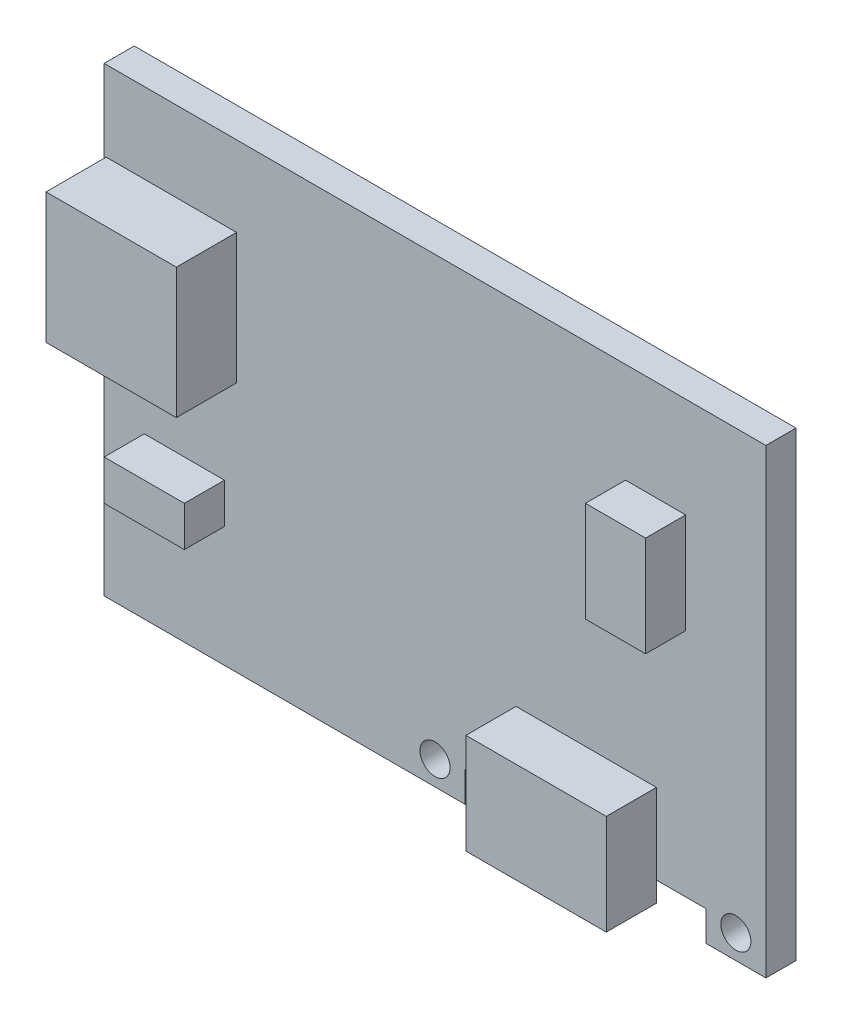
ISO-10303-21;
HEADER;
FILE_DESCRIPTION(('STEP AP214'),'2;1');
FILE_NAME('part.step','',(''),(''),'','','');
FILE_SCHEMA(('AUTOMOTIVE_DESIGN { 1 0 10303 214 1 1 1 1 }'));
ENDSEC;
DATA;
#1=APPLICATION_CONTEXT('core data for automotive mechanical design processes');
#2=APPLICATION_PROTOCOL_DEFINITION('international standard','automotive_design',2000,#1);
#3=PRODUCT_CONTEXT('',#1,'mechanical');
#4=PRODUCT('Part','Part','',(#3));
#5=PRODUCT_RELATED_PRODUCT_CATEGORY('part','',(#4));
#6=PRODUCT_DEFINITION_FORMATION('','',#4);
#7=PRODUCT_DEFINITION_CONTEXT('part definition',#1,'design');
#8=PRODUCT_DEFINITION('design','',#6,#7);
#9=PRODUCT_DEFINITION_SHAPE('','',#8);
#10=(LENGTH_UNIT() NAMED_UNIT(*) SI_UNIT(.MILLI.,.METRE.));
#11=(NAMED_UNIT(*) PLANE_ANGLE_UNIT() SI_UNIT($,.RADIAN.));
#12=(NAMED_UNIT(*) SI_UNIT($,.STERADIAN.) SOLID_ANGLE_UNIT());
#13=UNCERTAINTY_MEASURE_WITH_UNIT(LENGTH_MEASURE(1.E-05),#10,'distance_accuracy_value','');
#14=(GEOMETRIC_REPRESENTATION_CONTEXT(3) GLOBAL_UNCERTAINTY_ASSIGNED_CONTEXT((#13)) GLOBAL_UNIT_ASSIGNED_CONTEXT((#10,
#11,#12)) REPRESENTATION_CONTEXT('',''));
#15=CARTESIAN_POINT('',(0.,0.,0.));
#16=DIRECTION('',(0.,0.,1.));
#17=DIRECTION('',(1.,0.,0.));
#18=AXIS2_PLACEMENT_3D('',#15,#16,#17);
#19=CARTESIAN_POINT('',(0.,0.,1.5));
#20=DIRECTION('',(0.,0.,-1.));
#21=DIRECTION('',(-1.,0.,0.));
#22=AXIS2_PLACEMENT_3D('',#19,#20,#21);
#23=PLANE('',#22);
#24=DIRECTION('',(0.,-1.,0.));
#25=VECTOR('',#24,1.);
#26=CARTESIAN_POINT('',(0.1,19.,1.5));
#27=LINE('',#26,#25);
#28=CARTESIAN_POINT('',(0.1,19.,1.5));
#29=VERTEX_POINT('',#28);
#30=CARTESIAN_POINT('',(0.100000000000001,12.5,1.5));
#31=VERTEX_POINT('',#30);
#32=EDGE_CURVE('E233',#29,#31,#27,.T.);
#33=ORIENTED_EDGE('',*,*,#32,.F.);
#34=DIRECTION('',(-1.,0.,0.));
#35=VECTOR('',#34,1.);
#36=CARTESIAN_POINT('',(0.1,19.,1.5));
#37=LINE('',#36,#35);
#38=CARTESIAN_POINT('',(6.6,19.,1.5));
#39=VERTEX_POINT('',#38);
#40=EDGE_CURVE('E248',#39,#29,#37,.T.);
#41=ORIENTED_EDGE('',*,*,#40,.F.);
#42=DIRECTION('',(0.,1.,0.));
#43=VECTOR('',#42,1.);
#44=CARTESIAN_POINT('',(6.6,19.,1.5));
#45=LINE('',#44,#43);
#46=CARTESIAN_POINT('',(6.6,12.5,1.5));
#47=VERTEX_POINT('',#46);
#48=EDGE_CURVE('E260',#47,#39,#45,.T.);
#49=ORIENTED_EDGE('',*,*,#48,.F.);
#50=DIRECTION('',(1.,0.,0.));
#51=VECTOR('',#50,1.);
#52=CARTESIAN_POINT('',(0.100000000000001,12.5,1.5));
#53=LINE('',#52,#51);
#54=EDGE_CURVE('E63',#31,#47,#53,.T.);
#55=ORIENTED_EDGE('',*,*,#54,.F.);
#56=EDGE_LOOP('',(#33,#41,#49,#55));
#57=FACE_BOUND('',#56,.T.);
#58=DIRECTION('',(0.,-1.,0.));
#59=VECTOR('',#58,1.);
#60=CARTESIAN_POINT('',(2.,8.,1.5));
#61=LINE('',#60,#59);
#62=CARTESIAN_POINT('',(2.,8.,1.5));
#63=VERTEX_POINT('',#62);
#64=CARTESIAN_POINT('',(2.,6.,1.5));
#65=VERTEX_POINT('',#64);
#66=EDGE_CURVE('E326',#63,#65,#61,.T.);
#67=ORIENTED_EDGE('',*,*,#66,.F.);
#68=DIRECTION('',(-1.,0.,0.));
#69=VECTOR('',#68,1.);
#70=CARTESIAN_POINT('',(2.,8.,1.5));
#71=LINE('',#70,#69);
#72=CARTESIAN_POINT('',(6.,8.,1.5));
#73=VERTEX_POINT('',#72);
#74=EDGE_CURVE('E332',#73,#63,#71,.T.);
#75=ORIENTED_EDGE('',*,*,#74,.F.);
#76=DIRECTION('',(0.,1.,0.));
#77=VECTOR('',#76,1.);
#78=CARTESIAN_POINT('',(6.,8.,1.5));
#79=LINE('',#78,#77);
#80=CARTESIAN_POINT('',(6.,6.,1.5));
#81=VERTEX_POINT('',#80);
#82=EDGE_CURVE('E349',#81,#73,#79,.T.);
#83=ORIENTED_EDGE('',*,*,#82,.F.);
#84=DIRECTION('',(1.,0.,0.));
#85=VECTOR('',#84,1.);
#86=CARTESIAN_POINT('',(2.,6.,1.5));
#87=LINE('',#86,#85);
#88=EDGE_CURVE('E345',#65,#81,#87,.T.);
#89=ORIENTED_EDGE('',*,*,#88,.F.);
#90=EDGE_LOOP('',(#67,#75,#83,#89));
#91=FACE_BOUND('',#90,.T.);
#92=CARTESIAN_POINT('',(31.5,1.2,1.5));
#93=DIRECTION('',(0.,0.,1.));
#94=DIRECTION('',(1.,0.,0.));
#95=AXIS2_PLACEMENT_3D('',#92,#93,#94);
#96=CIRCLE('',#95,0.749999999999991);
#97=CARTESIAN_POINT('',(32.25,1.2,1.5));
#98=VERTEX_POINT('',#97);
#99=EDGE_CURVE('E377',#98,#98,#96,.T.);
#100=ORIENTED_EDGE('',*,*,#99,.F.);
#101=EDGE_LOOP('',(#100));
#102=FACE_BOUND('',#101,.T.);
#103=CARTESIAN_POINT('',(16.5,1.2,1.5));
#104=DIRECTION('',(0.,0.,1.));
#105=DIRECTION('',(1.,0.,0.));
#106=AXIS2_PLACEMENT_3D('',#103,#104,#105);
#107=CIRCLE('',#106,0.750000000000002);
#108=CARTESIAN_POINT('',(17.25,1.2,1.5));
#109=VERTEX_POINT('',#108);
#110=EDGE_CURVE('E371',#109,#109,#107,.T.);
#111=ORIENTED_EDGE('',*,*,#110,.F.);
#112=EDGE_LOOP('',(#111));
#113=FACE_BOUND('',#112,.T.);
#114=DIRECTION('',(0.,-1.,0.));
#115=VECTOR('',#114,1.);
#116=CARTESIAN_POINT('',(26.,18.,1.5));
#117=LINE('',#116,#115);
#118=CARTESIAN_POINT('',(26.,18.,1.5));
#119=VERTEX_POINT('',#118);
#120=CARTESIAN_POINT('',(26.,13.,1.5));
#121=VERTEX_POINT('',#120);
#122=EDGE_CURVE('E281',#119,#121,#117,.T.);
#123=ORIENTED_EDGE('',*,*,#122,.F.);
#124=DIRECTION('',(-1.,0.,0.));
#125=VECTOR('',#124,1.);
#126=CARTESIAN_POINT('',(26.,18.,1.5));
#127=LINE('',#126,#125);
#128=CARTESIAN_POINT('',(29.,18.,1.5));
#129=VERTEX_POINT('',#128);
#130=EDGE_CURVE('E287',#129,#119,#127,.T.);
#131=ORIENTED_EDGE('',*,*,#130,.F.);
#132=DIRECTION('',(0.,1.,0.));
#133=VECTOR('',#132,1.);
#134=CARTESIAN_POINT('',(29.,18.,1.5));
#135=LINE('',#134,#133);
#136=CARTESIAN_POINT('',(29.,13.,1.5));
#137=VERTEX_POINT('',#136);
#138=EDGE_CURVE('E304',#137,#129,#135,.T.);
#139=ORIENTED_EDGE('',*,*,#138,.F.);
#140=DIRECTION('',(1.,0.,0.));
#141=VECTOR('',#140,1.);
#142=CARTESIAN_POINT('',(26.,13.,1.5));
#143=LINE('',#142,#141);
#144=EDGE_CURVE('E300',#121,#137,#143,.T.);
#145=ORIENTED_EDGE('',*,*,#144,.F.);
#146=EDGE_LOOP('',(#123,#131,#139,#145));
#147=FACE_BOUND('',#146,.T.);
#148=DIRECTION('',(0.,-1.,0.));
#149=VECTOR('',#148,1.);
#150=CARTESIAN_POINT('',(20.5390833684802,5.5,1.5));
#151=LINE('',#150,#149);
#152=CARTESIAN_POINT('',(20.5390833684802,5.5,1.5));
#153=VERTEX_POINT('',#152);
#154=CARTESIAN_POINT('',(20.5390833684802,1.5,1.5));
#155=VERTEX_POINT('',#154);
#156=EDGE_CURVE('E55',#153,#155,#151,.T.);
#157=ORIENTED_EDGE('',*,*,#156,.F.);
#158=DIRECTION('',(-1.,0.,0.));
#159=VECTOR('',#158,1.);
#160=CARTESIAN_POINT('',(20.5390833684802,5.5,1.5));
#161=LINE('',#160,#159);
#162=CARTESIAN_POINT('',(27.5390833684802,5.5,1.5));
#163=VERTEX_POINT('',#162);
#164=EDGE_CURVE('E227',#163,#153,#161,.T.);
#165=ORIENTED_EDGE('',*,*,#164,.F.);
#166=DIRECTION('',(0.,1.,0.));
#167=VECTOR('',#166,1.);
#168=CARTESIAN_POINT('',(27.5390833684802,5.5,1.5));
#169=LINE('',#168,#167);
#170=CARTESIAN_POINT('',(27.5390833684802,1.5,1.5));
#171=VERTEX_POINT('',#170);
#172=EDGE_CURVE('E506',#171,#163,#169,.T.);
#173=ORIENTED_EDGE('',*,*,#172,.F.);
#174=DIRECTION('',(-1.,0.,0.));
#175=VECTOR('',#174,1.);
#176=CARTESIAN_POINT('',(18.,1.5,1.5));
#177=LINE('',#176,#175);
#178=CARTESIAN_POINT('',(30.,1.5,1.5));
#179=VERTEX_POINT('',#178);
#180=EDGE_CURVE('E393',#179,#171,#177,.T.);
#181=ORIENTED_EDGE('',*,*,#180,.F.);
#182=DIRECTION('',(0.,1.,0.));
#183=VECTOR('',#182,1.);
#184=CARTESIAN_POINT('',(30.,0.,1.5));
#185=LINE('',#184,#183);
#186=CARTESIAN_POINT('',(30.,0.,1.5));
#187=VERTEX_POINT('',#186);
#188=EDGE_CURVE('E404',#187,#179,#185,.T.);
#189=ORIENTED_EDGE('',*,*,#188,.F.);
#190=DIRECTION('',(1.,0.,0.));
#191=VECTOR('',#190,1.);
#192=CARTESIAN_POINT('',(0.,0.,1.5));
#193=LINE('',#192,#191);
#194=CARTESIAN_POINT('',(33.,0.,1.5));
#195=VERTEX_POINT('',#194);
#196=EDGE_CURVE('E431',#187,#195,#193,.T.);
#197=ORIENTED_EDGE('',*,*,#196,.T.);
#198=DIRECTION('',(0.,1.,0.));
#199=VECTOR('',#198,1.);
#200=CARTESIAN_POINT('',(33.,0.,1.5));
#201=LINE('',#200,#199);
#202=CARTESIAN_POINT('',(33.,23.,1.5));
#203=VERTEX_POINT('',#202);
#204=EDGE_CURVE('E437',#195,#203,#201,.T.);
#205=ORIENTED_EDGE('',*,*,#204,.T.);
#206=DIRECTION('',(-1.,0.,0.));
#207=VECTOR('',#206,1.);
#208=CARTESIAN_POINT('',(0.,23.,1.5));
#209=LINE('',#208,#207);
#210=CARTESIAN_POINT('',(0.,23.,1.5));
#211=VERTEX_POINT('',#210);
#212=EDGE_CURVE('E440',#203,#211,#209,.T.);
#213=ORIENTED_EDGE('',*,*,#212,.T.);
#214=DIRECTION('',(0.,-1.,0.));
#215=VECTOR('',#214,1.);
#216=CARTESIAN_POINT('',(0.,0.,1.5));
#217=LINE('',#216,#215);
#218=CARTESIAN_POINT('',(0.,0.,1.5));
#219=VERTEX_POINT('',#218);
#220=EDGE_CURVE('E427',#211,#219,#217,.T.);
#221=ORIENTED_EDGE('',*,*,#220,.T.);
#222=CARTESIAN_POINT('',(18.,0.,1.5));
#223=VERTEX_POINT('',#222);
#224=EDGE_CURVE('E433',#219,#223,#193,.T.);
#225=ORIENTED_EDGE('',*,*,#224,.T.);
#226=DIRECTION('',(0.,-1.,0.));
#227=VECTOR('',#226,1.);
#228=CARTESIAN_POINT('',(18.,0.,1.5));
#229=LINE('',#228,#227);
#230=CARTESIAN_POINT('',(18.,1.5,1.5));
#231=VERTEX_POINT('',#230);
#232=EDGE_CURVE('E376',#231,#223,#229,.T.);
#233=ORIENTED_EDGE('',*,*,#232,.F.);
#234=EDGE_CURVE('E408',#155,#231,#177,.T.);
#235=ORIENTED_EDGE('',*,*,#234,.F.);
#236=EDGE_LOOP('',(#157,#165,#173,#181,#189,#197,#205,#213,#221,#225,#233,#235));
#237=FACE_BOUND('',#236,.T.);
#238=ADVANCED_FACE('F39',(#57,#91,#102,#113,#147,#237),#23,.F.);
#239=CARTESIAN_POINT('',(0.,0.,1.5));
#240=DIRECTION('',(0.,1.,0.));
#241=DIRECTION('',(0.,0.,1.));
#242=AXIS2_PLACEMENT_3D('',#239,#240,#241);
#243=PLANE('',#242);
#244=DIRECTION('',(1.,0.,0.));
#245=VECTOR('',#244,1.);
#246=CARTESIAN_POINT('',(0.,0.,0.));
#247=LINE('',#246,#245);
#248=CARTESIAN_POINT('',(0.,0.,0.));
#249=VERTEX_POINT('',#248);
#250=CARTESIAN_POINT('',(18.,0.,0.));
#251=VERTEX_POINT('',#250);
#252=EDGE_CURVE('E448',#249,#251,#247,.T.);
#253=ORIENTED_EDGE('',*,*,#252,.T.);
#254=DIRECTION('',(0.,0.,1.));
#255=VECTOR('',#254,1.);
#256=CARTESIAN_POINT('',(18.,0.,0.));
#257=LINE('',#256,#255);
#258=EDGE_CURVE('E401',#251,#223,#257,.T.);
#259=ORIENTED_EDGE('',*,*,#258,.T.);
#260=ORIENTED_EDGE('',*,*,#224,.F.);
#261=DIRECTION('',(0.,0.,-1.));
#262=VECTOR('',#261,1.);
#263=CARTESIAN_POINT('',(0.,0.,1.5));
#264=LINE('',#263,#262);
#265=EDGE_CURVE('E11',#219,#249,#264,.T.);
#266=ORIENTED_EDGE('',*,*,#265,.T.);
#267=EDGE_LOOP('',(#253,#259,#260,#266));
#268=FACE_BOUND('',#267,.T.);
#269=ADVANCED_FACE('F551',(#268),#243,.F.);
#270=CARTESIAN_POINT('',(0.,0.,1.5));
#271=DIRECTION('',(1.,0.,0.));
#272=DIRECTION('',(0.,0.,-1.));
#273=AXIS2_PLACEMENT_3D('',#270,#271,#272);
#274=PLANE('',#273);
#275=DIRECTION('',(0.,-1.,0.));
#276=VECTOR('',#275,1.);
#277=CARTESIAN_POINT('',(0.,0.,0.));
#278=LINE('',#277,#276);
#279=CARTESIAN_POINT('',(0.,23.,0.));
#280=VERTEX_POINT('',#279);
#281=EDGE_CURVE('E417',#280,#249,#278,.T.);
#282=ORIENTED_EDGE('',*,*,#281,.T.);
#283=ORIENTED_EDGE('',*,*,#265,.F.);
#284=ORIENTED_EDGE('',*,*,#220,.F.);
#285=DIRECTION('',(0.,0.,-1.));
#286=VECTOR('',#285,1.);
#287=CARTESIAN_POINT('',(0.,23.,1.5));
#288=LINE('',#287,#286);
#289=EDGE_CURVE('E443',#211,#280,#288,.T.);
#290=ORIENTED_EDGE('',*,*,#289,.T.);
#291=EDGE_LOOP('',(#282,#283,#284,#290));
#292=FACE_BOUND('',#291,.T.);
#293=ADVANCED_FACE('F41',(#292),#274,.F.);
#294=ORIENTED_EDGE('',*,*,#196,.F.);
#295=DIRECTION('',(0.,0.,1.));
#296=VECTOR('',#295,1.);
#297=CARTESIAN_POINT('',(30.,0.,0.));
#298=LINE('',#297,#296);
#299=CARTESIAN_POINT('',(30.,0.,0.));
#300=VERTEX_POINT('',#299);
#301=EDGE_CURVE('E421',#300,#187,#298,.T.);
#302=ORIENTED_EDGE('',*,*,#301,.F.);
#303=CARTESIAN_POINT('',(33.,0.,0.));
#304=VERTEX_POINT('',#303);
#305=EDGE_CURVE('E447',#300,#304,#247,.T.);
#306=ORIENTED_EDGE('',*,*,#305,.T.);
#307=DIRECTION('',(0.,0.,-1.));
#308=VECTOR('',#307,1.);
#309=CARTESIAN_POINT('',(33.,0.,1.5));
#310=LINE('',#309,#308);
#311=EDGE_CURVE('E48',#195,#304,#310,.T.);
#312=ORIENTED_EDGE('',*,*,#311,.F.);
#313=EDGE_LOOP('',(#294,#302,#306,#312));
#314=FACE_BOUND('',#313,.T.);
#315=ADVANCED_FACE('F557',(#314),#243,.F.);
#316=CARTESIAN_POINT('',(33.,0.,1.5));
#317=DIRECTION('',(-1.,0.,0.));
#318=DIRECTION('',(0.,0.,1.));
#319=AXIS2_PLACEMENT_3D('',#316,#317,#318);
#320=PLANE('',#319);
#321=DIRECTION('',(0.,1.,0.));
#322=VECTOR('',#321,1.);
#323=CARTESIAN_POINT('',(33.,0.,0.));
#324=LINE('',#323,#322);
#325=CARTESIAN_POINT('',(33.,23.,0.));
#326=VERTEX_POINT('',#325);
#327=EDGE_CURVE('E452',#304,#326,#324,.T.);
#328=ORIENTED_EDGE('',*,*,#327,.T.);
#329=DIRECTION('',(0.,0.,-1.));
#330=VECTOR('',#329,1.);
#331=CARTESIAN_POINT('',(33.,23.,1.5));
#332=LINE('',#331,#330);
#333=EDGE_CURVE('E460',#203,#326,#332,.T.);
#334=ORIENTED_EDGE('',*,*,#333,.F.);
#335=ORIENTED_EDGE('',*,*,#204,.F.);
#336=ORIENTED_EDGE('',*,*,#311,.T.);
#337=EDGE_LOOP('',(#328,#334,#335,#336));
#338=FACE_BOUND('',#337,.T.);
#339=ADVANCED_FACE('F469',(#338),#320,.F.);
#340=CARTESIAN_POINT('',(0.,23.,1.5));
#341=DIRECTION('',(0.,-1.,0.));
#342=DIRECTION('',(0.,0.,-1.));
#343=AXIS2_PLACEMENT_3D('',#340,#341,#342);
#344=PLANE('',#343);
#345=DIRECTION('',(-1.,0.,0.));
#346=VECTOR('',#345,1.);
#347=CARTESIAN_POINT('',(0.,23.,0.));
#348=LINE('',#347,#346);
#349=EDGE_CURVE('E432',#326,#280,#348,.T.);
#350=ORIENTED_EDGE('',*,*,#349,.T.);
#351=ORIENTED_EDGE('',*,*,#289,.F.);
#352=ORIENTED_EDGE('',*,*,#212,.F.);
#353=ORIENTED_EDGE('',*,*,#333,.T.);
#354=EDGE_LOOP('',(#350,#351,#352,#353));
#355=FACE_BOUND('',#354,.T.);
#356=ADVANCED_FACE('F480',(#355),#344,.F.);
#357=CARTESIAN_POINT('',(0.,0.,0.));
#358=DIRECTION('',(0.,0.,-1.));
#359=DIRECTION('',(-1.,0.,0.));
#360=AXIS2_PLACEMENT_3D('',#357,#358,#359);
#361=PLANE('',#360);
#362=CARTESIAN_POINT('',(31.5,1.2,0.));
#363=DIRECTION('',(0.,0.,1.));
#364=DIRECTION('',(1.,0.,0.));
#365=AXIS2_PLACEMENT_3D('',#362,#363,#364);
#366=CIRCLE('',#365,0.749999999999991);
#367=CARTESIAN_POINT('',(32.25,1.2,0.));
#368=VERTEX_POINT('',#367);
#369=EDGE_CURVE('E372',#368,#368,#366,.T.);
#370=ORIENTED_EDGE('',*,*,#369,.T.);
#371=EDGE_LOOP('',(#370));
#372=FACE_BOUND('',#371,.T.);
#373=CARTESIAN_POINT('',(16.5,1.2,0.));
#374=DIRECTION('',(0.,0.,1.));
#375=DIRECTION('',(1.,0.,0.));
#376=AXIS2_PLACEMENT_3D('',#373,#374,#375);
#377=CIRCLE('',#376,0.750000000000002);
#378=CARTESIAN_POINT('',(17.25,1.2,0.));
#379=VERTEX_POINT('',#378);
#380=EDGE_CURVE('E381',#379,#379,#377,.T.);
#381=ORIENTED_EDGE('',*,*,#380,.T.);
#382=EDGE_LOOP('',(#381));
#383=FACE_BOUND('',#382,.T.);
#384=DIRECTION('',(0.,-1.,0.));
#385=VECTOR('',#384,1.);
#386=CARTESIAN_POINT('',(18.,0.,0.));
#387=LINE('',#386,#385);
#388=CARTESIAN_POINT('',(18.,1.5,0.));
#389=VERTEX_POINT('',#388);
#390=EDGE_CURVE('E388',#389,#251,#387,.T.);
#391=ORIENTED_EDGE('',*,*,#390,.T.);
#392=ORIENTED_EDGE('',*,*,#252,.F.);
#393=ORIENTED_EDGE('',*,*,#281,.F.);
#394=ORIENTED_EDGE('',*,*,#349,.F.);
#395=ORIENTED_EDGE('',*,*,#327,.F.);
#396=ORIENTED_EDGE('',*,*,#305,.F.);
#397=DIRECTION('',(0.,1.,0.));
#398=VECTOR('',#397,1.);
#399=CARTESIAN_POINT('',(30.,0.,0.));
#400=LINE('',#399,#398);
#401=CARTESIAN_POINT('',(30.,1.5,0.));
#402=VERTEX_POINT('',#401);
#403=EDGE_CURVE('E392',#300,#402,#400,.T.);
#404=ORIENTED_EDGE('',*,*,#403,.T.);
#405=DIRECTION('',(-1.,0.,0.));
#406=VECTOR('',#405,1.);
#407=CARTESIAN_POINT('',(18.,1.5,0.));
#408=LINE('',#407,#406);
#409=EDGE_CURVE('E397',#402,#389,#408,.T.);
#410=ORIENTED_EDGE('',*,*,#409,.T.);
#411=EDGE_LOOP('',(#391,#392,#393,#394,#395,#396,#404,#410));
#412=FACE_BOUND('',#411,.T.);
#413=ADVANCED_FACE('F476',(#372,#383,#412),#361,.T.);
#414=CARTESIAN_POINT('',(18.,0.,0.));
#415=DIRECTION('',(-1.,0.,0.));
#416=DIRECTION('',(0.,0.,1.));
#417=AXIS2_PLACEMENT_3D('',#414,#415,#416);
#418=PLANE('',#417);
#419=ORIENTED_EDGE('',*,*,#232,.T.);
#420=ORIENTED_EDGE('',*,*,#258,.F.);
#421=ORIENTED_EDGE('',*,*,#390,.F.);
#422=DIRECTION('',(0.,0.,1.));
#423=VECTOR('',#422,1.);
#424=CARTESIAN_POINT('',(18.,1.5,0.));
#425=LINE('',#424,#423);
#426=EDGE_CURVE('E413',#389,#231,#425,.T.);
#427=ORIENTED_EDGE('',*,*,#426,.T.);
#428=EDGE_LOOP('',(#419,#420,#421,#427));
#429=FACE_BOUND('',#428,.T.);
#430=ADVANCED_FACE('F500',(#429),#418,.F.);
#431=CARTESIAN_POINT('',(18.,1.5,0.));
#432=DIRECTION('',(0.,1.,0.));
#433=DIRECTION('',(0.,0.,1.));
#434=AXIS2_PLACEMENT_3D('',#431,#432,#433);
#435=PLANE('',#434);
#436=ORIENTED_EDGE('',*,*,#180,.T.);
#437=EDGE_CURVE('E412',#171,#155,#177,.T.);
#438=ORIENTED_EDGE('',*,*,#437,.T.);
#439=ORIENTED_EDGE('',*,*,#234,.T.);
#440=ORIENTED_EDGE('',*,*,#426,.F.);
#441=ORIENTED_EDGE('',*,*,#409,.F.);
#442=DIRECTION('',(0.,0.,1.));
#443=VECTOR('',#442,1.);
#444=CARTESIAN_POINT('',(30.,1.5,0.));
#445=LINE('',#444,#443);
#446=EDGE_CURVE('E418',#402,#179,#445,.T.);
#447=ORIENTED_EDGE('',*,*,#446,.T.);
#448=EDGE_LOOP('',(#436,#438,#439,#440,#441,#447));
#449=FACE_BOUND('',#448,.T.);
#450=ADVANCED_FACE('F497',(#449),#435,.F.);
#451=CARTESIAN_POINT('',(30.,0.,0.));
#452=DIRECTION('',(1.,0.,0.));
#453=DIRECTION('',(0.,0.,-1.));
#454=AXIS2_PLACEMENT_3D('',#451,#452,#453);
#455=PLANE('',#454);
#456=ORIENTED_EDGE('',*,*,#188,.T.);
#457=ORIENTED_EDGE('',*,*,#446,.F.);
#458=ORIENTED_EDGE('',*,*,#403,.F.);
#459=ORIENTED_EDGE('',*,*,#301,.T.);
#460=EDGE_LOOP('',(#456,#457,#458,#459));
#461=FACE_BOUND('',#460,.T.);
#462=ADVANCED_FACE('F503',(#461),#455,.F.);
#463=CARTESIAN_POINT('',(16.5,1.2,0.));
#464=DIRECTION('',(0.,0.,1.));
#465=DIRECTION('',(1.,0.,0.));
#466=AXIS2_PLACEMENT_3D('',#463,#464,#465);
#467=CYLINDRICAL_SURFACE('',#466,0.750000000000002);
#468=ORIENTED_EDGE('',*,*,#380,.F.);
#469=EDGE_LOOP('',(#468));
#470=FACE_BOUND('',#469,.T.);
#471=ORIENTED_EDGE('',*,*,#110,.T.);
#472=EDGE_LOOP('',(#471));
#473=FACE_BOUND('',#472,.T.);
#474=ADVANCED_FACE('F606',(#470,#473),#467,.F.);
#475=CARTESIAN_POINT('',(31.5,1.2,0.));
#476=DIRECTION('',(0.,0.,1.));
#477=DIRECTION('',(1.,0.,0.));
#478=AXIS2_PLACEMENT_3D('',#475,#476,#477);
#479=CYLINDRICAL_SURFACE('',#478,0.749999999999991);
#480=ORIENTED_EDGE('',*,*,#369,.F.);
#481=EDGE_LOOP('',(#480));
#482=FACE_BOUND('',#481,.T.);
#483=ORIENTED_EDGE('',*,*,#99,.T.);
#484=EDGE_LOOP('',(#483));
#485=FACE_BOUND('',#484,.T.);
#486=ADVANCED_FACE('F619',(#482,#485),#479,.F.);
#487=CARTESIAN_POINT('',(2.,8.,3.5));
#488=DIRECTION('',(1.,0.,0.));
#489=DIRECTION('',(0.,1.,0.));
#490=AXIS2_PLACEMENT_3D('',#487,#488,#489);
#491=PLANE('',#490);
#492=ORIENTED_EDGE('',*,*,#66,.T.);
#493=DIRECTION('',(0.,0.,-1.));
#494=VECTOR('',#493,1.);
#495=CARTESIAN_POINT('',(2.,6.,3.5));
#496=LINE('',#495,#494);
#497=CARTESIAN_POINT('',(2.,6.,3.5));
#498=VERTEX_POINT('',#497);
#499=EDGE_CURVE('E367',#498,#65,#496,.T.);
#500=ORIENTED_EDGE('',*,*,#499,.F.);
#501=DIRECTION('',(0.,-1.,0.));
#502=VECTOR('',#501,1.);
#503=CARTESIAN_POINT('',(2.,8.,3.5));
#504=LINE('',#503,#502);
#505=CARTESIAN_POINT('',(2.,8.,3.5));
#506=VERTEX_POINT('',#505);
#507=EDGE_CURVE('E327',#506,#498,#504,.T.);
#508=ORIENTED_EDGE('',*,*,#507,.F.);
#509=DIRECTION('',(0.,0.,-1.));
#510=VECTOR('',#509,1.);
#511=CARTESIAN_POINT('',(2.,8.,3.5));
#512=LINE('',#511,#510);
#513=EDGE_CURVE('E341',#506,#63,#512,.T.);
#514=ORIENTED_EDGE('',*,*,#513,.T.);
#515=EDGE_LOOP('',(#492,#500,#508,#514));
#516=FACE_BOUND('',#515,.T.);
#517=ADVANCED_FACE('F629',(#516),#491,.F.);
#518=CARTESIAN_POINT('',(2.,6.,3.5));
#519=DIRECTION('',(0.,1.,0.));
#520=DIRECTION('',(0.,0.,1.));
#521=AXIS2_PLACEMENT_3D('',#518,#519,#520);
#522=PLANE('',#521);
#523=ORIENTED_EDGE('',*,*,#88,.T.);
#524=DIRECTION('',(0.,0.,-1.));
#525=VECTOR('',#524,1.);
#526=CARTESIAN_POINT('',(6.,6.,3.5));
#527=LINE('',#526,#525);
#528=CARTESIAN_POINT('',(6.,6.,3.5));
#529=VERTEX_POINT('',#528);
#530=EDGE_CURVE('E363',#529,#81,#527,.T.);
#531=ORIENTED_EDGE('',*,*,#530,.F.);
#532=DIRECTION('',(1.,0.,0.));
#533=VECTOR('',#532,1.);
#534=CARTESIAN_POINT('',(2.,6.,3.5));
#535=LINE('',#534,#533);
#536=EDGE_CURVE('E331',#498,#529,#535,.T.);
#537=ORIENTED_EDGE('',*,*,#536,.F.);
#538=ORIENTED_EDGE('',*,*,#499,.T.);
#539=EDGE_LOOP('',(#523,#531,#537,#538));
#540=FACE_BOUND('',#539,.T.);
#541=ADVANCED_FACE('F639',(#540),#522,.F.);
#542=CARTESIAN_POINT('',(6.,8.,3.5));
#543=DIRECTION('',(-1.,0.,0.));
#544=DIRECTION('',(0.,0.,1.));
#545=AXIS2_PLACEMENT_3D('',#542,#543,#544);
#546=PLANE('',#545);
#547=ORIENTED_EDGE('',*,*,#82,.T.);
#548=DIRECTION('',(0.,0.,-1.));
#549=VECTOR('',#548,1.);
#550=CARTESIAN_POINT('',(6.,8.,3.5));
#551=LINE('',#550,#549);
#552=CARTESIAN_POINT('',(6.,8.,3.5));
#553=VERTEX_POINT('',#552);
#554=EDGE_CURVE('E359',#553,#73,#551,.T.);
#555=ORIENTED_EDGE('',*,*,#554,.F.);
#556=DIRECTION('',(0.,1.,0.));
#557=VECTOR('',#556,1.);
#558=CARTESIAN_POINT('',(6.,8.,3.5));
#559=LINE('',#558,#557);
#560=EDGE_CURVE('E335',#529,#553,#559,.T.);
#561=ORIENTED_EDGE('',*,*,#560,.F.);
#562=ORIENTED_EDGE('',*,*,#530,.T.);
#563=EDGE_LOOP('',(#547,#555,#561,#562));
#564=FACE_BOUND('',#563,.T.);
#565=ADVANCED_FACE('F649',(#564),#546,.F.);
#566=CARTESIAN_POINT('',(2.,8.,3.5));
#567=DIRECTION('',(0.,-1.,0.));
#568=DIRECTION('',(0.,0.,-1.));
#569=AXIS2_PLACEMENT_3D('',#566,#567,#568);
#570=PLANE('',#569);
#571=ORIENTED_EDGE('',*,*,#74,.T.);
#572=ORIENTED_EDGE('',*,*,#513,.F.);
#573=DIRECTION('',(-1.,0.,0.));
#574=VECTOR('',#573,1.);
#575=CARTESIAN_POINT('',(2.,8.,3.5));
#576=LINE('',#575,#574);
#577=EDGE_CURVE('E338',#553,#506,#576,.T.);
#578=ORIENTED_EDGE('',*,*,#577,.F.);
#579=ORIENTED_EDGE('',*,*,#554,.T.);
#580=EDGE_LOOP('',(#571,#572,#578,#579));
#581=FACE_BOUND('',#580,.T.);
#582=ADVANCED_FACE('F659',(#581),#570,.F.);
#583=CARTESIAN_POINT('',(0.,0.,3.5));
#584=DIRECTION('',(0.,0.,1.));
#585=DIRECTION('',(1.,0.,0.));
#586=AXIS2_PLACEMENT_3D('',#583,#584,#585);
#587=PLANE('',#586);
#588=ORIENTED_EDGE('',*,*,#507,.T.);
#589=ORIENTED_EDGE('',*,*,#536,.T.);
#590=ORIENTED_EDGE('',*,*,#560,.T.);
#591=ORIENTED_EDGE('',*,*,#577,.T.);
#592=EDGE_LOOP('',(#588,#589,#590,#591));
#593=FACE_BOUND('',#592,.T.);
#594=ADVANCED_FACE('F669',(#593),#587,.T.);
#595=CARTESIAN_POINT('',(26.,18.,3.5));
#596=DIRECTION('',(1.,0.,0.));
#597=DIRECTION('',(0.,1.,0.));
#598=AXIS2_PLACEMENT_3D('',#595,#596,#597);
#599=PLANE('',#598);
#600=ORIENTED_EDGE('',*,*,#122,.T.);
#601=DIRECTION('',(0.,0.,-1.));
#602=VECTOR('',#601,1.);
#603=CARTESIAN_POINT('',(26.,13.,3.5));
#604=LINE('',#603,#602);
#605=CARTESIAN_POINT('',(26.,13.,3.5));
#606=VERTEX_POINT('',#605);
#607=EDGE_CURVE('E322',#606,#121,#604,.T.);
#608=ORIENTED_EDGE('',*,*,#607,.F.);
#609=DIRECTION('',(0.,-1.,0.));
#610=VECTOR('',#609,1.);
#611=CARTESIAN_POINT('',(26.,18.,3.5));
#612=LINE('',#611,#610);
#613=CARTESIAN_POINT('',(26.,18.,3.5));
#614=VERTEX_POINT('',#613);
#615=EDGE_CURVE('E282',#614,#606,#612,.T.);
#616=ORIENTED_EDGE('',*,*,#615,.F.);
#617=DIRECTION('',(0.,0.,-1.));
#618=VECTOR('',#617,1.);
#619=CARTESIAN_POINT('',(26.,18.,3.5));
#620=LINE('',#619,#618);
#621=EDGE_CURVE('E296',#614,#119,#620,.T.);
#622=ORIENTED_EDGE('',*,*,#621,.T.);
#623=EDGE_LOOP('',(#600,#608,#616,#622));
#624=FACE_BOUND('',#623,.T.);
#625=ADVANCED_FACE('F679',(#624),#599,.F.);
#626=CARTESIAN_POINT('',(26.,13.,3.5));
#627=DIRECTION('',(0.,1.,0.));
#628=DIRECTION('',(0.,0.,1.));
#629=AXIS2_PLACEMENT_3D('',#626,#627,#628);
#630=PLANE('',#629);
#631=ORIENTED_EDGE('',*,*,#144,.T.);
#632=DIRECTION('',(0.,0.,-1.));
#633=VECTOR('',#632,1.);
#634=CARTESIAN_POINT('',(29.,13.,3.5));
#635=LINE('',#634,#633);
#636=CARTESIAN_POINT('',(29.,13.,3.5));
#637=VERTEX_POINT('',#636);
#638=EDGE_CURVE('E318',#637,#137,#635,.T.);
#639=ORIENTED_EDGE('',*,*,#638,.F.);
#640=DIRECTION('',(1.,0.,0.));
#641=VECTOR('',#640,1.);
#642=CARTESIAN_POINT('',(26.,13.,3.5));
#643=LINE('',#642,#641);
#644=EDGE_CURVE('E286',#606,#637,#643,.T.);
#645=ORIENTED_EDGE('',*,*,#644,.F.);
#646=ORIENTED_EDGE('',*,*,#607,.T.);
#647=EDGE_LOOP('',(#631,#639,#645,#646));
#648=FACE_BOUND('',#647,.T.);
#649=ADVANCED_FACE('F689',(#648),#630,.F.);
#650=CARTESIAN_POINT('',(29.,18.,3.5));
#651=DIRECTION('',(-1.,0.,0.));
#652=DIRECTION('',(0.,0.,1.));
#653=AXIS2_PLACEMENT_3D('',#650,#651,#652);
#654=PLANE('',#653);
#655=ORIENTED_EDGE('',*,*,#138,.T.);
#656=DIRECTION('',(0.,0.,-1.));
#657=VECTOR('',#656,1.);
#658=CARTESIAN_POINT('',(29.,18.,3.5));
#659=LINE('',#658,#657);
#660=CARTESIAN_POINT('',(29.,18.,3.5));
#661=VERTEX_POINT('',#660);
#662=EDGE_CURVE('E314',#661,#129,#659,.T.);
#663=ORIENTED_EDGE('',*,*,#662,.F.);
#664=DIRECTION('',(0.,1.,0.));
#665=VECTOR('',#664,1.);
#666=CARTESIAN_POINT('',(29.,18.,3.5));
#667=LINE('',#666,#665);
#668=EDGE_CURVE('E290',#637,#661,#667,.T.);
#669=ORIENTED_EDGE('',*,*,#668,.F.);
#670=ORIENTED_EDGE('',*,*,#638,.T.);
#671=EDGE_LOOP('',(#655,#663,#669,#670));
#672=FACE_BOUND('',#671,.T.);
#673=ADVANCED_FACE('F699',(#672),#654,.F.);
#674=CARTESIAN_POINT('',(26.,18.,3.5));
#675=DIRECTION('',(0.,-1.,0.));
#676=DIRECTION('',(0.,0.,-1.));
#677=AXIS2_PLACEMENT_3D('',#674,#675,#676);
#678=PLANE('',#677);
#679=ORIENTED_EDGE('',*,*,#130,.T.);
#680=ORIENTED_EDGE('',*,*,#621,.F.);
#681=DIRECTION('',(-1.,0.,0.));
#682=VECTOR('',#681,1.);
#683=CARTESIAN_POINT('',(26.,18.,3.5));
#684=LINE('',#683,#682);
#685=EDGE_CURVE('E293',#661,#614,#684,.T.);
#686=ORIENTED_EDGE('',*,*,#685,.F.);
#687=ORIENTED_EDGE('',*,*,#662,.T.);
#688=EDGE_LOOP('',(#679,#680,#686,#687));
#689=FACE_BOUND('',#688,.T.);
#690=ADVANCED_FACE('F709',(#689),#678,.F.);
#691=CARTESIAN_POINT('',(0.,0.,3.5));
#692=DIRECTION('',(0.,0.,1.));
#693=DIRECTION('',(1.,0.,0.));
#694=AXIS2_PLACEMENT_3D('',#691,#692,#693);
#695=PLANE('',#694);
#696=ORIENTED_EDGE('',*,*,#615,.T.);
#697=ORIENTED_EDGE('',*,*,#644,.T.);
#698=ORIENTED_EDGE('',*,*,#668,.T.);
#699=ORIENTED_EDGE('',*,*,#685,.T.);
#700=EDGE_LOOP('',(#696,#697,#698,#699));
#701=FACE_BOUND('',#700,.T.);
#702=ADVANCED_FACE('F719',(#701),#695,.T.);
#703=CARTESIAN_POINT('',(0.1,19.,4.5));
#704=DIRECTION('',(1.,0.,0.));
#705=DIRECTION('',(0.,1.,0.));
#706=AXIS2_PLACEMENT_3D('',#703,#704,#705);
#707=PLANE('',#706);
#708=ORIENTED_EDGE('',*,*,#32,.T.);
#709=DIRECTION('',(0.,0.,-1.));
#710=VECTOR('',#709,1.);
#711=CARTESIAN_POINT('',(0.100000000000001,12.5,4.5));
#712=LINE('',#711,#710);
#713=CARTESIAN_POINT('',(0.100000000000001,12.5,4.5));
#714=VERTEX_POINT('',#713);
#715=EDGE_CURVE('E278',#714,#31,#712,.T.);
#716=ORIENTED_EDGE('',*,*,#715,.F.);
#717=DIRECTION('',(0.,-1.,0.));
#718=VECTOR('',#717,1.);
#719=CARTESIAN_POINT('',(0.1,19.,4.5));
#720=LINE('',#719,#718);
#721=CARTESIAN_POINT('',(0.1,19.,4.5));
#722=VERTEX_POINT('',#721);
#723=EDGE_CURVE('E243',#722,#714,#720,.T.);
#724=ORIENTED_EDGE('',*,*,#723,.F.);
#725=DIRECTION('',(0.,0.,-1.));
#726=VECTOR('',#725,1.);
#727=CARTESIAN_POINT('',(0.1,19.,4.5));
#728=LINE('',#727,#726);
#729=EDGE_CURVE('E256',#722,#29,#728,.T.);
#730=ORIENTED_EDGE('',*,*,#729,.T.);
#731=EDGE_LOOP('',(#708,#716,#724,#730));
#732=FACE_BOUND('',#731,.T.);
#733=ADVANCED_FACE('F729',(#732),#707,.F.);
#734=CARTESIAN_POINT('',(0.100000000000001,12.5,4.5));
#735=DIRECTION('',(0.,1.,0.));
#736=DIRECTION('',(0.,0.,1.));
#737=AXIS2_PLACEMENT_3D('',#734,#735,#736);
#738=PLANE('',#737);
#739=ORIENTED_EDGE('',*,*,#54,.T.);
#740=DIRECTION('',(0.,0.,-1.));
#741=VECTOR('',#740,1.);
#742=CARTESIAN_POINT('',(6.6,12.5,4.5));
#743=LINE('',#742,#741);
#744=CARTESIAN_POINT('',(6.6,12.5,4.5));
#745=VERTEX_POINT('',#744);
#746=EDGE_CURVE('E274',#745,#47,#743,.T.);
#747=ORIENTED_EDGE('',*,*,#746,.F.);
#748=DIRECTION('',(1.,0.,0.));
#749=VECTOR('',#748,1.);
#750=CARTESIAN_POINT('',(0.100000000000001,12.5,4.5));
#751=LINE('',#750,#749);
#752=EDGE_CURVE('E247',#714,#745,#751,.T.);
#753=ORIENTED_EDGE('',*,*,#752,.F.);
#754=ORIENTED_EDGE('',*,*,#715,.T.);
#755=EDGE_LOOP('',(#739,#747,#753,#754));
#756=FACE_BOUND('',#755,.T.);
#757=ADVANCED_FACE('F739',(#756),#738,.F.);
#758=CARTESIAN_POINT('',(6.6,19.,4.5));
#759=DIRECTION('',(-1.,0.,0.));
#760=DIRECTION('',(0.,0.,1.));
#761=AXIS2_PLACEMENT_3D('',#758,#759,#760);
#762=PLANE('',#761);
#763=ORIENTED_EDGE('',*,*,#48,.T.);
#764=DIRECTION('',(0.,0.,-1.));
#765=VECTOR('',#764,1.);
#766=CARTESIAN_POINT('',(6.6,19.,4.5));
#767=LINE('',#766,#765);
#768=CARTESIAN_POINT('',(6.6,19.,4.5));
#769=VERTEX_POINT('',#768);
#770=EDGE_CURVE('E270',#769,#39,#767,.T.);
#771=ORIENTED_EDGE('',*,*,#770,.F.);
#772=DIRECTION('',(0.,1.,0.));
#773=VECTOR('',#772,1.);
#774=CARTESIAN_POINT('',(6.6,19.,4.5));
#775=LINE('',#774,#773);
#776=EDGE_CURVE('E251',#745,#769,#775,.T.);
#777=ORIENTED_EDGE('',*,*,#776,.F.);
#778=ORIENTED_EDGE('',*,*,#746,.T.);
#779=EDGE_LOOP('',(#763,#771,#777,#778));
#780=FACE_BOUND('',#779,.T.);
#781=ADVANCED_FACE('F749',(#780),#762,.F.);
#782=CARTESIAN_POINT('',(0.1,19.,4.5));
#783=DIRECTION('',(0.,-1.,0.));
#784=DIRECTION('',(0.,0.,-1.));
#785=AXIS2_PLACEMENT_3D('',#782,#783,#784);
#786=PLANE('',#785);
#787=ORIENTED_EDGE('',*,*,#40,.T.);
#788=ORIENTED_EDGE('',*,*,#729,.F.);
#789=DIRECTION('',(-1.,0.,0.));
#790=VECTOR('',#789,1.);
#791=CARTESIAN_POINT('',(0.1,19.,4.5));
#792=LINE('',#791,#790);
#793=EDGE_CURVE('E254',#769,#722,#792,.T.);
#794=ORIENTED_EDGE('',*,*,#793,.F.);
#795=ORIENTED_EDGE('',*,*,#770,.T.);
#796=EDGE_LOOP('',(#787,#788,#794,#795));
#797=FACE_BOUND('',#796,.T.);
#798=ADVANCED_FACE('F545',(#797),#786,.F.);
#799=CARTESIAN_POINT('',(0.,0.,4.5));
#800=DIRECTION('',(0.,0.,1.));
#801=DIRECTION('',(1.,0.,0.));
#802=AXIS2_PLACEMENT_3D('',#799,#800,#801);
#803=PLANE('',#802);
#804=ORIENTED_EDGE('',*,*,#723,.T.);
#805=ORIENTED_EDGE('',*,*,#752,.T.);
#806=ORIENTED_EDGE('',*,*,#776,.T.);
#807=ORIENTED_EDGE('',*,*,#793,.T.);
#808=EDGE_LOOP('',(#804,#805,#806,#807));
#809=FACE_BOUND('',#808,.T.);
#810=ADVANCED_FACE('F538',(#809),#803,.T.);
#811=CARTESIAN_POINT('',(0.,0.,1.5));
#812=DIRECTION('',(0.,0.,1.));
#813=DIRECTION('',(1.,0.,0.));
#814=AXIS2_PLACEMENT_3D('',#811,#812,#813);
#815=PLANE('',#814);
#816=CARTESIAN_POINT('',(20.5390833684802,0.5,1.5));
#817=VERTEX_POINT('',#816);
#818=EDGE_CURVE('E230',#155,#817,#151,.T.);
#819=ORIENTED_EDGE('',*,*,#818,.F.);
#820=ORIENTED_EDGE('',*,*,#437,.F.);
#821=CARTESIAN_POINT('',(27.5390833684802,0.5,1.5));
#822=VERTEX_POINT('',#821);
#823=EDGE_CURVE('E512',#822,#171,#169,.T.);
#824=ORIENTED_EDGE('',*,*,#823,.F.);
#825=DIRECTION('',(1.,0.,0.));
#826=VECTOR('',#825,1.);
#827=CARTESIAN_POINT('',(20.5390833684802,0.5,1.5));
#828=LINE('',#827,#826);
#829=EDGE_CURVE('E513',#817,#822,#828,.T.);
#830=ORIENTED_EDGE('',*,*,#829,.F.);
#831=EDGE_LOOP('',(#819,#820,#824,#830));
#832=FACE_BOUND('',#831,.T.);
#833=ADVANCED_FACE('F536',(#832),#815,.F.);
#834=CARTESIAN_POINT('',(20.5390833684802,5.5,4.));
#835=DIRECTION('',(1.,0.,0.));
#836=DIRECTION('',(0.,0.,-1.));
#837=AXIS2_PLACEMENT_3D('',#834,#835,#836);
#838=PLANE('',#837);
#839=ORIENTED_EDGE('',*,*,#156,.T.);
#840=ORIENTED_EDGE('',*,*,#818,.T.);
#841=DIRECTION('',(0.,0.,-1.));
#842=VECTOR('',#841,1.);
#843=CARTESIAN_POINT('',(20.5390833684802,0.5,4.));
#844=LINE('',#843,#842);
#845=CARTESIAN_POINT('',(20.5390833684802,0.5,4.));
#846=VERTEX_POINT('',#845);
#847=EDGE_CURVE('E212',#846,#817,#844,.T.);
#848=ORIENTED_EDGE('',*,*,#847,.F.);
#849=DIRECTION('',(0.,-1.,0.));
#850=VECTOR('',#849,1.);
#851=CARTESIAN_POINT('',(20.5390833684802,5.5,4.));
#852=LINE('',#851,#850);
#853=CARTESIAN_POINT('',(20.5390833684802,5.5,4.));
#854=VERTEX_POINT('',#853);
#855=EDGE_CURVE('E219',#854,#846,#852,.T.);
#856=ORIENTED_EDGE('',*,*,#855,.F.);
#857=DIRECTION('',(0.,0.,-1.));
#858=VECTOR('',#857,1.);
#859=CARTESIAN_POINT('',(20.5390833684802,5.5,4.));
#860=LINE('',#859,#858);
#861=EDGE_CURVE('E522',#854,#153,#860,.T.);
#862=ORIENTED_EDGE('',*,*,#861,.T.);
#863=EDGE_LOOP('',(#839,#840,#848,#856,#862));
#864=FACE_BOUND('',#863,.T.);
#865=ADVANCED_FACE('F229',(#864),#838,.F.);
#866=CARTESIAN_POINT('',(20.5390833684802,0.5,4.));
#867=DIRECTION('',(0.,1.,0.));
#868=DIRECTION('',(-1.,0.,0.));
#869=AXIS2_PLACEMENT_3D('',#866,#867,#868);
#870=PLANE('',#869);
#871=ORIENTED_EDGE('',*,*,#829,.T.);
#872=DIRECTION('',(0.,0.,-1.));
#873=VECTOR('',#872,1.);
#874=CARTESIAN_POINT('',(27.5390833684802,0.5,4.));
#875=LINE('',#874,#873);
#876=CARTESIAN_POINT('',(27.5390833684802,0.5,4.));
#877=VERTEX_POINT('',#876);
#878=EDGE_CURVE('E214',#877,#822,#875,.T.);
#879=ORIENTED_EDGE('',*,*,#878,.F.);
#880=DIRECTION('',(1.,0.,0.));
#881=VECTOR('',#880,1.);
#882=CARTESIAN_POINT('',(20.5390833684802,0.5,4.));
#883=LINE('',#882,#881);
#884=EDGE_CURVE('E208',#846,#877,#883,.T.);
#885=ORIENTED_EDGE('',*,*,#884,.F.);
#886=ORIENTED_EDGE('',*,*,#847,.T.);
#887=EDGE_LOOP('',(#871,#879,#885,#886));
#888=FACE_BOUND('',#887,.T.);
#889=ADVANCED_FACE('F210',(#888),#870,.F.);
#890=CARTESIAN_POINT('',(27.5390833684802,5.5,4.));
#891=DIRECTION('',(-1.,0.,0.));
#892=DIRECTION('',(0.,0.,1.));
#893=AXIS2_PLACEMENT_3D('',#890,#891,#892);
#894=PLANE('',#893);
#895=ORIENTED_EDGE('',*,*,#823,.T.);
#896=ORIENTED_EDGE('',*,*,#172,.T.);
#897=DIRECTION('',(0.,0.,-1.));
#898=VECTOR('',#897,1.);
#899=CARTESIAN_POINT('',(27.5390833684802,5.5,4.));
#900=LINE('',#899,#898);
#901=CARTESIAN_POINT('',(27.5390833684802,5.5,4.));
#902=VERTEX_POINT('',#901);
#903=EDGE_CURVE('E239',#902,#163,#900,.T.);
#904=ORIENTED_EDGE('',*,*,#903,.F.);
#905=DIRECTION('',(0.,1.,0.));
#906=VECTOR('',#905,1.);
#907=CARTESIAN_POINT('',(27.5390833684802,5.5,4.));
#908=LINE('',#907,#906);
#909=EDGE_CURVE('E218',#877,#902,#908,.T.);
#910=ORIENTED_EDGE('',*,*,#909,.F.);
#911=ORIENTED_EDGE('',*,*,#878,.T.);
#912=EDGE_LOOP('',(#895,#896,#904,#910,#911));
#913=FACE_BOUND('',#912,.T.);
#914=ADVANCED_FACE('F527',(#913),#894,.F.);
#915=CARTESIAN_POINT('',(20.5390833684802,5.5,4.));
#916=DIRECTION('',(0.,-1.,0.));
#917=DIRECTION('',(0.,0.,-1.));
#918=AXIS2_PLACEMENT_3D('',#915,#916,#917);
#919=PLANE('',#918);
#920=ORIENTED_EDGE('',*,*,#164,.T.);
#921=ORIENTED_EDGE('',*,*,#861,.F.);
#922=DIRECTION('',(-1.,0.,0.));
#923=VECTOR('',#922,1.);
#924=CARTESIAN_POINT('',(20.5390833684802,5.5,4.));
#925=LINE('',#924,#923);
#926=EDGE_CURVE('E224',#902,#854,#925,.T.);
#927=ORIENTED_EDGE('',*,*,#926,.F.);
#928=ORIENTED_EDGE('',*,*,#903,.T.);
#929=EDGE_LOOP('',(#920,#921,#927,#928));
#930=FACE_BOUND('',#929,.T.);
#931=ADVANCED_FACE('F526',(#930),#919,.F.);
#932=CARTESIAN_POINT('',(0.,0.,4.));
#933=DIRECTION('',(0.,0.,1.));
#934=DIRECTION('',(1.,0.,0.));
#935=AXIS2_PLACEMENT_3D('',#932,#933,#934);
#936=PLANE('',#935);
#937=ORIENTED_EDGE('',*,*,#855,.T.);
#938=ORIENTED_EDGE('',*,*,#884,.T.);
#939=ORIENTED_EDGE('',*,*,#909,.T.);
#940=ORIENTED_EDGE('',*,*,#926,.T.);
#941=EDGE_LOOP('',(#937,#938,#939,#940));
#942=FACE_BOUND('',#941,.T.);
#943=ADVANCED_FACE('F222',(#942),#936,.T.);
#944=CLOSED_SHELL('',(#238,#269,#293,#315,#339,#356,#413,#430,#450,#462,#474,#486,#517,#541,
#565,#582,#594,#625,#649,#673,#690,#702,#733,#757,#781,#798,#810,#833,#865,#889,#914,#931,#943));
#945=MANIFOLD_SOLID_BREP('B2',#944);
#946=ADVANCED_BREP_SHAPE_REPRESENTATION('',(#18,#945),#14);
#947=SHAPE_DEFINITION_REPRESENTATION(#9,#946);
ENDSEC;
END-ISO-10303-21;
